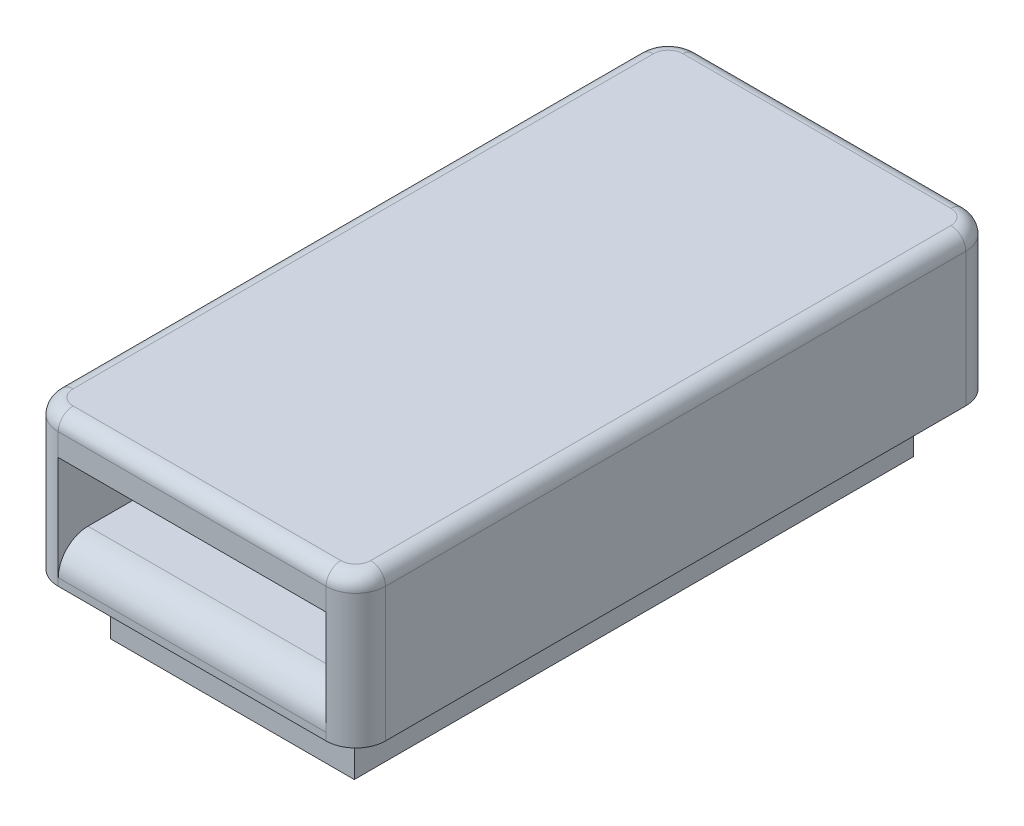
ISO-10303-21;
HEADER;
FILE_DESCRIPTION(('STEP AP214'),'2;1');
FILE_NAME('part.step','',(''),(''),'','','');
FILE_SCHEMA(('AUTOMOTIVE_DESIGN { 1 0 10303 214 1 1 1 1 }'));
ENDSEC;
DATA;
#1=APPLICATION_CONTEXT('core data for automotive mechanical design processes');
#2=APPLICATION_PROTOCOL_DEFINITION('international standard','automotive_design',2000,#1);
#3=PRODUCT_CONTEXT('',#1,'mechanical');
#4=PRODUCT('Part','Part','',(#3));
#5=PRODUCT_RELATED_PRODUCT_CATEGORY('part','',(#4));
#6=PRODUCT_DEFINITION_FORMATION('','',#4);
#7=PRODUCT_DEFINITION_CONTEXT('part definition',#1,'design');
#8=PRODUCT_DEFINITION('design','',#6,#7);
#9=PRODUCT_DEFINITION_SHAPE('','',#8);
#10=(LENGTH_UNIT() NAMED_UNIT(*) SI_UNIT(.MILLI.,.METRE.));
#11=(NAMED_UNIT(*) PLANE_ANGLE_UNIT() SI_UNIT($,.RADIAN.));
#12=(NAMED_UNIT(*) SI_UNIT($,.STERADIAN.) SOLID_ANGLE_UNIT());
#13=UNCERTAINTY_MEASURE_WITH_UNIT(LENGTH_MEASURE(1.E-05),#10,'distance_accuracy_value','');
#14=(GEOMETRIC_REPRESENTATION_CONTEXT(3) GLOBAL_UNCERTAINTY_ASSIGNED_CONTEXT((#13)) GLOBAL_UNIT_ASSIGNED_CONTEXT((#10,
#11,#12)) REPRESENTATION_CONTEXT('',''));
#15=CARTESIAN_POINT('',(0.,0.,0.));
#16=DIRECTION('',(0.,0.,1.));
#17=DIRECTION('',(1.,0.,0.));
#18=AXIS2_PLACEMENT_3D('',#15,#16,#17);
#19=CARTESIAN_POINT('',(-8.99999999999998,10.,21.5));
#20=DIRECTION('',(0.,0.,-1.));
#21=DIRECTION('',(-1.,0.,0.));
#22=AXIS2_PLACEMENT_3D('',#19,#20,#21);
#23=PLANE('',#22);
#24=DIRECTION('',(0.,-1.,0.));
#25=VECTOR('',#24,1.);
#26=CARTESIAN_POINT('',(8.99999999999999,10.,21.5));
#27=LINE('',#26,#25);
#28=CARTESIAN_POINT('',(8.99999999999999,0.499999999999999,21.5));
#29=VERTEX_POINT('',#28);
#30=CARTESIAN_POINT('',(8.99999999999999,0.,21.5));
#31=VERTEX_POINT('',#30);
#32=EDGE_CURVE('E208',#29,#31,#27,.T.);
#33=ORIENTED_EDGE('',*,*,#32,.F.);
#34=DIRECTION('',(1.,0.,0.));
#35=VECTOR('',#34,1.);
#36=CARTESIAN_POINT('',(-8.99999999999999,0.5,21.5));
#37=LINE('',#36,#35);
#38=CARTESIAN_POINT('',(-8.99999999999998,0.499999999999999,21.5));
#39=VERTEX_POINT('',#38);
#40=EDGE_CURVE('E437',#29,#39,#37,.F.);
#41=ORIENTED_EDGE('',*,*,#40,.T.);
#42=DIRECTION('',(0.,-1.,0.));
#43=VECTOR('',#42,1.);
#44=CARTESIAN_POINT('',(-8.99999999999998,10.,21.5));
#45=LINE('',#44,#43);
#46=CARTESIAN_POINT('',(-8.99999999999998,0.,21.5));
#47=VERTEX_POINT('',#46);
#48=EDGE_CURVE('E219',#39,#47,#45,.T.);
#49=ORIENTED_EDGE('',*,*,#48,.T.);
#50=DIRECTION('',(1.,0.,0.));
#51=VECTOR('',#50,1.);
#52=CARTESIAN_POINT('',(-8.99999999999998,0.,21.5));
#53=LINE('',#52,#51);
#54=EDGE_CURVE('E313',#47,#31,#53,.T.);
#55=ORIENTED_EDGE('',*,*,#54,.T.);
#56=EDGE_LOOP('',(#33,#41,#49,#55));
#57=FACE_BOUND('',#56,.T.);
#58=ADVANCED_FACE('F47',(#57),#23,.F.);
#59=CARTESIAN_POINT('',(-8.99999999999998,10.,-21.5));
#60=DIRECTION('',(0.,0.,-1.));
#61=DIRECTION('',(-1.,0.,0.));
#62=AXIS2_PLACEMENT_3D('',#59,#60,#61);
#63=PLANE('',#62);
#64=DIRECTION('',(0.,-1.,0.));
#65=VECTOR('',#64,1.);
#66=CARTESIAN_POINT('',(-8.99999999999998,10.,-21.5));
#67=LINE('',#66,#65);
#68=CARTESIAN_POINT('',(-8.99999999999998,0.499999999999999,-21.5));
#69=VERTEX_POINT('',#68);
#70=CARTESIAN_POINT('',(-8.99999999999998,0.,-21.5));
#71=VERTEX_POINT('',#70);
#72=EDGE_CURVE('E325',#69,#71,#67,.T.);
#73=ORIENTED_EDGE('',*,*,#72,.F.);
#74=DIRECTION('',(1.,0.,0.));
#75=VECTOR('',#74,1.);
#76=CARTESIAN_POINT('',(-8.99999999999998,0.499999999999999,-21.5));
#77=LINE('',#76,#75);
#78=CARTESIAN_POINT('',(8.99999999999999,0.499999999999999,-21.5));
#79=VERTEX_POINT('',#78);
#80=EDGE_CURVE('E441',#69,#79,#77,.T.);
#81=ORIENTED_EDGE('',*,*,#80,.T.);
#82=DIRECTION('',(0.,-1.,0.));
#83=VECTOR('',#82,1.);
#84=CARTESIAN_POINT('',(8.99999999999999,10.,-21.5));
#85=LINE('',#84,#83);
#86=CARTESIAN_POINT('',(8.99999999999999,0.,-21.5));
#87=VERTEX_POINT('',#86);
#88=EDGE_CURVE('E347',#79,#87,#85,.T.);
#89=ORIENTED_EDGE('',*,*,#88,.T.);
#90=DIRECTION('',(1.,0.,0.));
#91=VECTOR('',#90,1.);
#92=CARTESIAN_POINT('',(-8.99999999999998,0.,-21.5));
#93=LINE('',#92,#91);
#94=EDGE_CURVE('E297',#71,#87,#93,.T.);
#95=ORIENTED_EDGE('',*,*,#94,.F.);
#96=EDGE_LOOP('',(#73,#81,#89,#95));
#97=FACE_BOUND('',#96,.T.);
#98=ADVANCED_FACE('F456',(#97),#63,.T.);
#99=CARTESIAN_POINT('',(-9.,10.,-19.5));
#100=DIRECTION('',(0.,-1.,0.));
#101=DIRECTION('',(0.,0.,-1.));
#102=AXIS2_PLACEMENT_3D('',#99,#100,#101);
#103=CYLINDRICAL_SURFACE('',#102,2.);
#104=DIRECTION('',(0.,-1.,0.));
#105=VECTOR('',#104,1.);
#106=CARTESIAN_POINT('',(-11.,10.,-19.5));
#107=LINE('',#106,#105);
#108=CARTESIAN_POINT('',(-11.,9.,-19.5));
#109=VERTEX_POINT('',#108);
#110=CARTESIAN_POINT('',(-11.,0.,-19.5));
#111=VERTEX_POINT('',#110);
#112=EDGE_CURVE('E326',#109,#111,#107,.T.);
#113=ORIENTED_EDGE('',*,*,#112,.F.);
#114=CARTESIAN_POINT('',(-9.,9.,-19.5));
#115=DIRECTION('',(0.,-1.,0.));
#116=DIRECTION('',(0.,0.,-1.));
#117=AXIS2_PLACEMENT_3D('',#114,#115,#116);
#118=CIRCLE('',#117,2.);
#119=CARTESIAN_POINT('',(-8.99999999999998,9.,-21.5));
#120=VERTEX_POINT('',#119);
#121=EDGE_CURVE('E384',#109,#120,#118,.T.);
#122=ORIENTED_EDGE('',*,*,#121,.T.);
#123=CARTESIAN_POINT('',(-8.99999999999999,7.5,-21.5));
#124=VERTEX_POINT('',#123);
#125=EDGE_CURVE('E348',#120,#124,#67,.T.);
#126=ORIENTED_EDGE('',*,*,#125,.T.);
#127=EDGE_CURVE('E352',#124,#69,#67,.T.);
#128=ORIENTED_EDGE('',*,*,#127,.T.);
#129=ORIENTED_EDGE('',*,*,#72,.T.);
#130=CARTESIAN_POINT('',(-9.,0.,-19.5));
#131=DIRECTION('',(0.,-1.,0.));
#132=DIRECTION('',(0.,0.,-1.));
#133=AXIS2_PLACEMENT_3D('',#130,#131,#132);
#134=CIRCLE('',#133,2.);
#135=EDGE_CURVE('E284',#111,#71,#134,.T.);
#136=ORIENTED_EDGE('',*,*,#135,.F.);
#137=EDGE_LOOP('',(#113,#122,#126,#128,#129,#136));
#138=FACE_BOUND('',#137,.T.);
#139=ADVANCED_FACE('F494',(#138),#103,.T.);
#140=CARTESIAN_POINT('',(-11.,10.,19.5));
#141=DIRECTION('',(-1.,0.,0.));
#142=DIRECTION('',(0.,0.,1.));
#143=AXIS2_PLACEMENT_3D('',#140,#141,#142);
#144=PLANE('',#143);
#145=DIRECTION('',(0.,-1.,0.));
#146=VECTOR('',#145,1.);
#147=CARTESIAN_POINT('',(-11.,10.,19.5));
#148=LINE('',#147,#146);
#149=CARTESIAN_POINT('',(-11.,9.,19.5));
#150=VERTEX_POINT('',#149);
#151=CARTESIAN_POINT('',(-11.,0.,19.5));
#152=VERTEX_POINT('',#151);
#153=EDGE_CURVE('E330',#150,#152,#148,.T.);
#154=ORIENTED_EDGE('',*,*,#153,.F.);
#155=DIRECTION('',(0.,0.,-1.));
#156=VECTOR('',#155,1.);
#157=CARTESIAN_POINT('',(-11.,9.,-19.5));
#158=LINE('',#157,#156);
#159=EDGE_CURVE('E381',#150,#109,#158,.T.);
#160=ORIENTED_EDGE('',*,*,#159,.T.);
#161=ORIENTED_EDGE('',*,*,#112,.T.);
#162=DIRECTION('',(0.,0.,-1.));
#163=VECTOR('',#162,1.);
#164=CARTESIAN_POINT('',(-11.,0.,19.5));
#165=LINE('',#164,#163);
#166=EDGE_CURVE('E321',#152,#111,#165,.T.);
#167=ORIENTED_EDGE('',*,*,#166,.F.);
#168=EDGE_LOOP('',(#154,#160,#161,#167));
#169=FACE_BOUND('',#168,.T.);
#170=ADVANCED_FACE('F507',(#169),#144,.T.);
#171=CARTESIAN_POINT('',(-9.,10.,19.5));
#172=DIRECTION('',(0.,-1.,0.));
#173=DIRECTION('',(0.,0.,-1.));
#174=AXIS2_PLACEMENT_3D('',#171,#172,#173);
#175=CYLINDRICAL_SURFACE('',#174,2.);
#176=CARTESIAN_POINT('',(-8.99999999999998,9.,21.5));
#177=VERTEX_POINT('',#176);
#178=CARTESIAN_POINT('',(-8.99999999999999,7.5,21.5));
#179=VERTEX_POINT('',#178);
#180=EDGE_CURVE('E234',#177,#179,#45,.T.);
#181=ORIENTED_EDGE('',*,*,#180,.F.);
#182=CARTESIAN_POINT('',(-9.,9.,19.5));
#183=DIRECTION('',(0.,-1.,0.));
#184=DIRECTION('',(0.,0.,-1.));
#185=AXIS2_PLACEMENT_3D('',#182,#183,#184);
#186=CIRCLE('',#185,2.);
#187=EDGE_CURVE('E329',#177,#150,#186,.T.);
#188=ORIENTED_EDGE('',*,*,#187,.T.);
#189=ORIENTED_EDGE('',*,*,#153,.T.);
#190=CARTESIAN_POINT('',(-9.,0.,19.5));
#191=DIRECTION('',(0.,-1.,0.));
#192=DIRECTION('',(0.,0.,-1.));
#193=AXIS2_PLACEMENT_3D('',#190,#191,#192);
#194=CIRCLE('',#193,2.);
#195=EDGE_CURVE('E317',#47,#152,#194,.T.);
#196=ORIENTED_EDGE('',*,*,#195,.F.);
#197=ORIENTED_EDGE('',*,*,#48,.F.);
#198=EDGE_CURVE('E334',#179,#39,#45,.T.);
#199=ORIENTED_EDGE('',*,*,#198,.F.);
#200=EDGE_LOOP('',(#181,#188,#189,#196,#197,#199));
#201=FACE_BOUND('',#200,.T.);
#202=ADVANCED_FACE('F476',(#201),#175,.T.);
#203=CARTESIAN_POINT('',(8.99999999999999,9.,21.5));
#204=VERTEX_POINT('',#203);
#205=CARTESIAN_POINT('',(8.99999999999999,7.5,21.5));
#206=VERTEX_POINT('',#205);
#207=EDGE_CURVE('E207',#204,#206,#27,.T.);
#208=ORIENTED_EDGE('',*,*,#207,.F.);
#209=DIRECTION('',(1.,0.,0.));
#210=VECTOR('',#209,1.);
#211=CARTESIAN_POINT('',(-8.99999999999998,9.,21.5));
#212=LINE('',#211,#210);
#213=EDGE_CURVE('E398',#204,#177,#212,.F.);
#214=ORIENTED_EDGE('',*,*,#213,.T.);
#215=ORIENTED_EDGE('',*,*,#180,.T.);
#216=DIRECTION('',(1.,0.,0.));
#217=VECTOR('',#216,1.);
#218=CARTESIAN_POINT('',(-8.99999999999999,7.5,21.5));
#219=LINE('',#218,#217);
#220=EDGE_CURVE('E225',#179,#206,#219,.T.);
#221=ORIENTED_EDGE('',*,*,#220,.T.);
#222=EDGE_LOOP('',(#208,#214,#215,#221));
#223=FACE_BOUND('',#222,.T.);
#224=ADVANCED_FACE('F232',(#223),#23,.F.);
#225=CARTESIAN_POINT('',(9.,10.,19.5));
#226=DIRECTION('',(0.,-1.,0.));
#227=DIRECTION('',(0.,0.,-1.));
#228=AXIS2_PLACEMENT_3D('',#225,#226,#227);
#229=CYLINDRICAL_SURFACE('',#228,2.);
#230=DIRECTION('',(0.,-1.,0.));
#231=VECTOR('',#230,1.);
#232=CARTESIAN_POINT('',(11.,10.,19.5));
#233=LINE('',#232,#231);
#234=CARTESIAN_POINT('',(11.,9.,19.5));
#235=VERTEX_POINT('',#234);
#236=CARTESIAN_POINT('',(11.,0.,19.5));
#237=VERTEX_POINT('',#236);
#238=EDGE_CURVE('E336',#235,#237,#233,.T.);
#239=ORIENTED_EDGE('',*,*,#238,.F.);
#240=CARTESIAN_POINT('',(9.,9.,19.5));
#241=DIRECTION('',(0.,-1.,0.));
#242=DIRECTION('',(0.,0.,-1.));
#243=AXIS2_PLACEMENT_3D('',#240,#241,#242);
#244=CIRCLE('',#243,2.);
#245=EDGE_CURVE('E214',#235,#204,#244,.T.);
#246=ORIENTED_EDGE('',*,*,#245,.T.);
#247=ORIENTED_EDGE('',*,*,#207,.T.);
#248=EDGE_CURVE('E196',#206,#29,#27,.T.);
#249=ORIENTED_EDGE('',*,*,#248,.T.);
#250=ORIENTED_EDGE('',*,*,#32,.T.);
#251=CARTESIAN_POINT('',(9.,0.,19.5));
#252=DIRECTION('',(0.,1.,0.));
#253=DIRECTION('',(0.,0.,1.));
#254=AXIS2_PLACEMENT_3D('',#251,#252,#253);
#255=CIRCLE('',#254,2.);
#256=EDGE_CURVE('E309',#31,#237,#255,.T.);
#257=ORIENTED_EDGE('',*,*,#256,.T.);
#258=EDGE_LOOP('',(#239,#246,#247,#249,#250,#257));
#259=FACE_BOUND('',#258,.T.);
#260=ADVANCED_FACE('F212',(#259),#229,.T.);
#261=CARTESIAN_POINT('',(11.,10.,19.5));
#262=DIRECTION('',(-1.,0.,0.));
#263=DIRECTION('',(0.,0.,1.));
#264=AXIS2_PLACEMENT_3D('',#261,#262,#263);
#265=PLANE('',#264);
#266=DIRECTION('',(0.,-1.,0.));
#267=VECTOR('',#266,1.);
#268=CARTESIAN_POINT('',(11.,10.,-19.5));
#269=LINE('',#268,#267);
#270=CARTESIAN_POINT('',(11.,9.,-19.5));
#271=VERTEX_POINT('',#270);
#272=CARTESIAN_POINT('',(11.,0.,-19.5));
#273=VERTEX_POINT('',#272);
#274=EDGE_CURVE('E339',#271,#273,#269,.T.);
#275=ORIENTED_EDGE('',*,*,#274,.F.);
#276=DIRECTION('',(0.,0.,-1.));
#277=VECTOR('',#276,1.);
#278=CARTESIAN_POINT('',(11.,9.,19.5));
#279=LINE('',#278,#277);
#280=EDGE_CURVE('E393',#271,#235,#279,.F.);
#281=ORIENTED_EDGE('',*,*,#280,.T.);
#282=ORIENTED_EDGE('',*,*,#238,.T.);
#283=DIRECTION('',(0.,0.,-1.));
#284=VECTOR('',#283,1.);
#285=CARTESIAN_POINT('',(11.,0.,19.5));
#286=LINE('',#285,#284);
#287=EDGE_CURVE('E305',#237,#273,#286,.T.);
#288=ORIENTED_EDGE('',*,*,#287,.T.);
#289=EDGE_LOOP('',(#275,#281,#282,#288));
#290=FACE_BOUND('',#289,.T.);
#291=ADVANCED_FACE('F505',(#290),#265,.F.);
#292=CARTESIAN_POINT('',(9.,10.,-19.5));
#293=DIRECTION('',(0.,-1.,0.));
#294=DIRECTION('',(0.,0.,-1.));
#295=AXIS2_PLACEMENT_3D('',#292,#293,#294);
#296=CYLINDRICAL_SURFACE('',#295,2.);
#297=CARTESIAN_POINT('',(8.99999999999999,9.,-21.5));
#298=VERTEX_POINT('',#297);
#299=CARTESIAN_POINT('',(8.99999999999999,7.5,-21.5));
#300=VERTEX_POINT('',#299);
#301=EDGE_CURVE('E342',#298,#300,#85,.T.);
#302=ORIENTED_EDGE('',*,*,#301,.F.);
#303=CARTESIAN_POINT('',(9.,9.,-19.5));
#304=DIRECTION('',(0.,-1.,0.));
#305=DIRECTION('',(0.,0.,-1.));
#306=AXIS2_PLACEMENT_3D('',#303,#304,#305);
#307=CIRCLE('',#306,2.);
#308=EDGE_CURVE('E390',#298,#271,#307,.T.);
#309=ORIENTED_EDGE('',*,*,#308,.T.);
#310=ORIENTED_EDGE('',*,*,#274,.T.);
#311=CARTESIAN_POINT('',(9.,0.,-19.5));
#312=DIRECTION('',(0.,-1.,0.));
#313=DIRECTION('',(0.,0.,-1.));
#314=AXIS2_PLACEMENT_3D('',#311,#312,#313);
#315=CIRCLE('',#314,2.);
#316=EDGE_CURVE('E301',#87,#273,#315,.T.);
#317=ORIENTED_EDGE('',*,*,#316,.F.);
#318=ORIENTED_EDGE('',*,*,#88,.F.);
#319=EDGE_CURVE('E346',#300,#79,#85,.T.);
#320=ORIENTED_EDGE('',*,*,#319,.F.);
#321=EDGE_LOOP('',(#302,#309,#310,#317,#318,#320));
#322=FACE_BOUND('',#321,.T.);
#323=ADVANCED_FACE('F462',(#322),#296,.T.);
#324=ORIENTED_EDGE('',*,*,#125,.F.);
#325=DIRECTION('',(1.,0.,0.));
#326=VECTOR('',#325,1.);
#327=CARTESIAN_POINT('',(8.99999999999999,9.,-21.5));
#328=LINE('',#327,#326);
#329=EDGE_CURVE('E387',#120,#298,#328,.T.);
#330=ORIENTED_EDGE('',*,*,#329,.T.);
#331=ORIENTED_EDGE('',*,*,#301,.T.);
#332=DIRECTION('',(1.,0.,0.));
#333=VECTOR('',#332,1.);
#334=CARTESIAN_POINT('',(-8.99999999999999,7.5,-21.5));
#335=LINE('',#334,#333);
#336=EDGE_CURVE('E227',#124,#300,#335,.T.);
#337=ORIENTED_EDGE('',*,*,#336,.F.);
#338=EDGE_LOOP('',(#324,#330,#331,#337));
#339=FACE_BOUND('',#338,.T.);
#340=ADVANCED_FACE('F496',(#339),#63,.T.);
#341=CARTESIAN_POINT('',(-9.,10.,-19.5));
#342=DIRECTION('',(0.,-1.,0.));
#343=DIRECTION('',(0.,0.,-1.));
#344=AXIS2_PLACEMENT_3D('',#341,#342,#343);
#345=PLANE('',#344);
#346=DIRECTION('',(0.,0.,-1.));
#347=VECTOR('',#346,1.);
#348=CARTESIAN_POINT('',(-10.,10.,19.5));
#349=LINE('',#348,#347);
#350=CARTESIAN_POINT('',(-10.,10.,-19.5));
#351=VERTEX_POINT('',#350);
#352=CARTESIAN_POINT('',(-10.,10.,19.5));
#353=VERTEX_POINT('',#352);
#354=EDGE_CURVE('E374',#351,#353,#349,.F.);
#355=ORIENTED_EDGE('',*,*,#354,.T.);
#356=CARTESIAN_POINT('',(-9.,10.,19.5));
#357=DIRECTION('',(0.,-1.,0.));
#358=DIRECTION('',(0.,0.,-1.));
#359=AXIS2_PLACEMENT_3D('',#356,#357,#358);
#360=CIRCLE('',#359,0.999999999999999);
#361=CARTESIAN_POINT('',(-8.99999999999999,10.,20.5));
#362=VERTEX_POINT('',#361);
#363=EDGE_CURVE('E377',#353,#362,#360,.F.);
#364=ORIENTED_EDGE('',*,*,#363,.T.);
#365=DIRECTION('',(1.,0.,0.));
#366=VECTOR('',#365,1.);
#367=CARTESIAN_POINT('',(-9.,10.,20.5));
#368=LINE('',#367,#366);
#369=CARTESIAN_POINT('',(8.99999999999999,10.,20.5));
#370=VERTEX_POINT('',#369);
#371=EDGE_CURVE('E356',#362,#370,#368,.T.);
#372=ORIENTED_EDGE('',*,*,#371,.T.);
#373=CARTESIAN_POINT('',(9.,10.,19.5));
#374=DIRECTION('',(0.,-1.,0.));
#375=DIRECTION('',(0.,0.,-1.));
#376=AXIS2_PLACEMENT_3D('',#373,#374,#375);
#377=CIRCLE('',#376,0.999999999999999);
#378=CARTESIAN_POINT('',(10.,10.,19.5));
#379=VERTEX_POINT('',#378);
#380=EDGE_CURVE('E359',#370,#379,#377,.F.);
#381=ORIENTED_EDGE('',*,*,#380,.T.);
#382=DIRECTION('',(0.,0.,-1.));
#383=VECTOR('',#382,1.);
#384=CARTESIAN_POINT('',(10.,10.,-19.5));
#385=LINE('',#384,#383);
#386=CARTESIAN_POINT('',(10.,10.,-19.5));
#387=VERTEX_POINT('',#386);
#388=EDGE_CURVE('E362',#379,#387,#385,.T.);
#389=ORIENTED_EDGE('',*,*,#388,.T.);
#390=CARTESIAN_POINT('',(9.,10.,-19.5));
#391=DIRECTION('',(0.,-1.,0.));
#392=DIRECTION('',(0.,0.,-1.));
#393=AXIS2_PLACEMENT_3D('',#390,#391,#392);
#394=CIRCLE('',#393,0.999999999999999);
#395=CARTESIAN_POINT('',(8.99999999999999,10.,-20.5));
#396=VERTEX_POINT('',#395);
#397=EDGE_CURVE('E365',#387,#396,#394,.F.);
#398=ORIENTED_EDGE('',*,*,#397,.T.);
#399=DIRECTION('',(1.,0.,0.));
#400=VECTOR('',#399,1.);
#401=CARTESIAN_POINT('',(-8.99999999999998,10.,-20.5));
#402=LINE('',#401,#400);
#403=CARTESIAN_POINT('',(-8.99999999999999,10.,-20.5));
#404=VERTEX_POINT('',#403);
#405=EDGE_CURVE('E368',#396,#404,#402,.F.);
#406=ORIENTED_EDGE('',*,*,#405,.T.);
#407=CARTESIAN_POINT('',(-9.,10.,-19.5));
#408=DIRECTION('',(0.,-1.,0.));
#409=DIRECTION('',(0.,0.,-1.));
#410=AXIS2_PLACEMENT_3D('',#407,#408,#409);
#411=CIRCLE('',#410,0.999999999999999);
#412=EDGE_CURVE('E371',#404,#351,#411,.F.);
#413=ORIENTED_EDGE('',*,*,#412,.T.);
#414=EDGE_LOOP('',(#355,#364,#372,#381,#389,#398,#406,#413));
#415=FACE_BOUND('',#414,.T.);
#416=ADVANCED_FACE('F518',(#415),#345,.F.);
#417=CARTESIAN_POINT('',(-9.,0.,-19.5));
#418=DIRECTION('',(0.,-1.,0.));
#419=DIRECTION('',(0.,0.,-1.));
#420=AXIS2_PLACEMENT_3D('',#417,#418,#419);
#421=PLANE('',#420);
#422=DIRECTION('',(0.,0.,-1.));
#423=VECTOR('',#422,1.);
#424=CARTESIAN_POINT('',(-8.2,0.,0.));
#425=LINE('',#424,#423);
#426=CARTESIAN_POINT('',(-8.2,0.,18.8));
#427=VERTEX_POINT('',#426);
#428=CARTESIAN_POINT('',(-8.2,0.,-18.8));
#429=VERTEX_POINT('',#428);
#430=EDGE_CURVE('E245',#427,#429,#425,.T.);
#431=ORIENTED_EDGE('',*,*,#430,.F.);
#432=DIRECTION('',(-1.,0.,0.));
#433=VECTOR('',#432,1.);
#434=CARTESIAN_POINT('',(0.,0.,18.8));
#435=LINE('',#434,#433);
#436=CARTESIAN_POINT('',(8.2,0.,18.8));
#437=VERTEX_POINT('',#436);
#438=EDGE_CURVE('E270',#437,#427,#435,.T.);
#439=ORIENTED_EDGE('',*,*,#438,.F.);
#440=DIRECTION('',(0.,0.,-1.));
#441=VECTOR('',#440,1.);
#442=CARTESIAN_POINT('',(8.2,0.,0.));
#443=LINE('',#442,#441);
#444=CARTESIAN_POINT('',(8.2,0.,-18.8));
#445=VERTEX_POINT('',#444);
#446=EDGE_CURVE('E273',#437,#445,#443,.T.);
#447=ORIENTED_EDGE('',*,*,#446,.T.);
#448=DIRECTION('',(-1.,0.,0.));
#449=VECTOR('',#448,1.);
#450=CARTESIAN_POINT('',(0.,0.,-18.8));
#451=LINE('',#450,#449);
#452=EDGE_CURVE('E256',#445,#429,#451,.T.);
#453=ORIENTED_EDGE('',*,*,#452,.T.);
#454=EDGE_LOOP('',(#431,#439,#447,#453));
#455=FACE_BOUND('',#454,.T.);
#456=ORIENTED_EDGE('',*,*,#135,.T.);
#457=ORIENTED_EDGE('',*,*,#94,.T.);
#458=ORIENTED_EDGE('',*,*,#316,.T.);
#459=ORIENTED_EDGE('',*,*,#287,.F.);
#460=ORIENTED_EDGE('',*,*,#256,.F.);
#461=ORIENTED_EDGE('',*,*,#54,.F.);
#462=ORIENTED_EDGE('',*,*,#195,.T.);
#463=ORIENTED_EDGE('',*,*,#166,.T.);
#464=EDGE_LOOP('',(#456,#457,#458,#459,#460,#461,#462,#463));
#465=FACE_BOUND('',#464,.T.);
#466=ADVANCED_FACE('F514',(#455,#465),#421,.T.);
#467=CARTESIAN_POINT('',(-8.2,-4.,0.));
#468=DIRECTION('',(1.,0.,0.));
#469=DIRECTION('',(0.,0.,-1.));
#470=AXIS2_PLACEMENT_3D('',#467,#468,#469);
#471=PLANE('',#470);
#472=ORIENTED_EDGE('',*,*,#430,.T.);
#473=DIRECTION('',(0.,1.,0.));
#474=VECTOR('',#473,1.);
#475=CARTESIAN_POINT('',(-8.2,-4.,-18.8));
#476=LINE('',#475,#474);
#477=CARTESIAN_POINT('',(-8.2,-4.,-18.8));
#478=VERTEX_POINT('',#477);
#479=EDGE_CURVE('E280',#478,#429,#476,.T.);
#480=ORIENTED_EDGE('',*,*,#479,.F.);
#481=DIRECTION('',(0.,0.,-1.));
#482=VECTOR('',#481,1.);
#483=CARTESIAN_POINT('',(-8.2,-4.,0.));
#484=LINE('',#483,#482);
#485=CARTESIAN_POINT('',(-8.2,-4.,18.8));
#486=VERTEX_POINT('',#485);
#487=EDGE_CURVE('E252',#486,#478,#484,.T.);
#488=ORIENTED_EDGE('',*,*,#487,.F.);
#489=DIRECTION('',(0.,1.,0.));
#490=VECTOR('',#489,1.);
#491=CARTESIAN_POINT('',(-8.2,-4.,18.8));
#492=LINE('',#491,#490);
#493=EDGE_CURVE('E267',#486,#427,#492,.T.);
#494=ORIENTED_EDGE('',*,*,#493,.T.);
#495=EDGE_LOOP('',(#472,#480,#488,#494));
#496=FACE_BOUND('',#495,.T.);
#497=ADVANCED_FACE('F517',(#496),#471,.F.);
#498=CARTESIAN_POINT('',(0.,-4.,-18.8));
#499=DIRECTION('',(0.,0.,-1.));
#500=DIRECTION('',(-1.,0.,0.));
#501=AXIS2_PLACEMENT_3D('',#498,#499,#500);
#502=PLANE('',#501);
#503=ORIENTED_EDGE('',*,*,#452,.F.);
#504=DIRECTION('',(0.,1.,0.));
#505=VECTOR('',#504,1.);
#506=CARTESIAN_POINT('',(8.2,-4.,-18.8));
#507=LINE('',#506,#505);
#508=CARTESIAN_POINT('',(8.2,-4.,-18.8));
#509=VERTEX_POINT('',#508);
#510=EDGE_CURVE('E285',#509,#445,#507,.T.);
#511=ORIENTED_EDGE('',*,*,#510,.F.);
#512=DIRECTION('',(-1.,0.,0.));
#513=VECTOR('',#512,1.);
#514=CARTESIAN_POINT('',(0.,-4.,-18.8));
#515=LINE('',#514,#513);
#516=EDGE_CURVE('E263',#509,#478,#515,.T.);
#517=ORIENTED_EDGE('',*,*,#516,.T.);
#518=ORIENTED_EDGE('',*,*,#479,.T.);
#519=EDGE_LOOP('',(#503,#511,#517,#518));
#520=FACE_BOUND('',#519,.T.);
#521=ADVANCED_FACE('F525',(#520),#502,.T.);
#522=CARTESIAN_POINT('',(8.2,-4.,0.));
#523=DIRECTION('',(1.,0.,0.));
#524=DIRECTION('',(0.,0.,-1.));
#525=AXIS2_PLACEMENT_3D('',#522,#523,#524);
#526=PLANE('',#525);
#527=ORIENTED_EDGE('',*,*,#446,.F.);
#528=DIRECTION('',(0.,1.,0.));
#529=VECTOR('',#528,1.);
#530=CARTESIAN_POINT('',(8.2,-4.,18.8));
#531=LINE('',#530,#529);
#532=CARTESIAN_POINT('',(8.2,-4.,18.8));
#533=VERTEX_POINT('',#532);
#534=EDGE_CURVE('E288',#533,#437,#531,.T.);
#535=ORIENTED_EDGE('',*,*,#534,.F.);
#536=DIRECTION('',(0.,0.,-1.));
#537=VECTOR('',#536,1.);
#538=CARTESIAN_POINT('',(8.2,-4.,0.));
#539=LINE('',#538,#537);
#540=EDGE_CURVE('E259',#533,#509,#539,.T.);
#541=ORIENTED_EDGE('',*,*,#540,.T.);
#542=ORIENTED_EDGE('',*,*,#510,.T.);
#543=EDGE_LOOP('',(#527,#535,#541,#542));
#544=FACE_BOUND('',#543,.T.);
#545=ADVANCED_FACE('F531',(#544),#526,.T.);
#546=CARTESIAN_POINT('',(0.,-4.,18.8));
#547=DIRECTION('',(0.,0.,-1.));
#548=DIRECTION('',(-1.,0.,0.));
#549=AXIS2_PLACEMENT_3D('',#546,#547,#548);
#550=PLANE('',#549);
#551=ORIENTED_EDGE('',*,*,#438,.T.);
#552=ORIENTED_EDGE('',*,*,#493,.F.);
#553=DIRECTION('',(-1.,0.,0.));
#554=VECTOR('',#553,1.);
#555=CARTESIAN_POINT('',(0.,-4.,18.8));
#556=LINE('',#555,#554);
#557=EDGE_CURVE('E255',#533,#486,#556,.T.);
#558=ORIENTED_EDGE('',*,*,#557,.F.);
#559=ORIENTED_EDGE('',*,*,#534,.T.);
#560=EDGE_LOOP('',(#551,#552,#558,#559));
#561=FACE_BOUND('',#560,.T.);
#562=ADVANCED_FACE('F527',(#561),#550,.F.);
#563=CARTESIAN_POINT('',(0.,-4.,0.));
#564=DIRECTION('',(0.,1.,0.));
#565=DIRECTION('',(0.,0.,1.));
#566=AXIS2_PLACEMENT_3D('',#563,#564,#565);
#567=PLANE('',#566);
#568=ORIENTED_EDGE('',*,*,#487,.T.);
#569=ORIENTED_EDGE('',*,*,#516,.F.);
#570=ORIENTED_EDGE('',*,*,#540,.F.);
#571=ORIENTED_EDGE('',*,*,#557,.T.);
#572=EDGE_LOOP('',(#568,#569,#570,#571));
#573=FACE_BOUND('',#572,.T.);
#574=ADVANCED_FACE('F530',(#573),#567,.F.);
#575=CARTESIAN_POINT('',(-8.99999999999999,7.5,21.5));
#576=DIRECTION('',(0.,1.,0.));
#577=DIRECTION('',(0.,0.,1.));
#578=AXIS2_PLACEMENT_3D('',#575,#576,#577);
#579=PLANE('',#578);
#580=ORIENTED_EDGE('',*,*,#336,.T.);
#581=DIRECTION('',(0.,0.,-1.));
#582=VECTOR('',#581,1.);
#583=CARTESIAN_POINT('',(8.99999999999999,7.5,21.5));
#584=LINE('',#583,#582);
#585=EDGE_CURVE('E200',#206,#300,#584,.T.);
#586=ORIENTED_EDGE('',*,*,#585,.F.);
#587=ORIENTED_EDGE('',*,*,#220,.F.);
#588=DIRECTION('',(0.,0.,-1.));
#589=VECTOR('',#588,1.);
#590=CARTESIAN_POINT('',(-8.99999999999999,7.5,21.5));
#591=LINE('',#590,#589);
#592=EDGE_CURVE('E242',#179,#124,#591,.T.);
#593=ORIENTED_EDGE('',*,*,#592,.T.);
#594=EDGE_LOOP('',(#580,#586,#587,#593));
#595=FACE_BOUND('',#594,.T.);
#596=ADVANCED_FACE('F223',(#595),#579,.F.);
#597=CARTESIAN_POINT('',(-8.99999999999999,7.5,21.5));
#598=DIRECTION('',(1.,0.,0.));
#599=DIRECTION('',(0.,0.,-1.));
#600=AXIS2_PLACEMENT_3D('',#597,#598,#599);
#601=PLANE('',#600);
#602=ORIENTED_EDGE('',*,*,#127,.F.);
#603=ORIENTED_EDGE('',*,*,#592,.F.);
#604=ORIENTED_EDGE('',*,*,#198,.T.);
#605=CARTESIAN_POINT('',(-8.99999999999999,0.5,19.5));
#606=DIRECTION('',(1.,0.,0.));
#607=DIRECTION('',(0.,0.,-1.));
#608=AXIS2_PLACEMENT_3D('',#605,#606,#607);
#609=CIRCLE('',#608,2.);
#610=CARTESIAN_POINT('',(-8.99999999999999,2.5,19.5));
#611=VERTEX_POINT('',#610);
#612=EDGE_CURVE('E447',#39,#611,#609,.F.);
#613=ORIENTED_EDGE('',*,*,#612,.T.);
#614=DIRECTION('',(0.,0.,-1.));
#615=VECTOR('',#614,1.);
#616=CARTESIAN_POINT('',(-8.99999999999999,2.5,21.5));
#617=LINE('',#616,#615);
#618=CARTESIAN_POINT('',(-8.99999999999999,2.5,-19.5));
#619=VERTEX_POINT('',#618);
#620=EDGE_CURVE('E246',#611,#619,#617,.T.);
#621=ORIENTED_EDGE('',*,*,#620,.T.);
#622=CARTESIAN_POINT('',(-8.99999999999999,0.499999999999999,-19.5));
#623=DIRECTION('',(1.,0.,0.));
#624=DIRECTION('',(0.,0.,-1.));
#625=AXIS2_PLACEMENT_3D('',#622,#623,#624);
#626=CIRCLE('',#625,2.);
#627=EDGE_CURVE('E11',#619,#69,#626,.F.);
#628=ORIENTED_EDGE('',*,*,#627,.T.);
#629=EDGE_LOOP('',(#602,#603,#604,#613,#621,#628));
#630=FACE_BOUND('',#629,.T.);
#631=ADVANCED_FACE('F468',(#630),#601,.T.);
#632=CARTESIAN_POINT('',(-8.99999999999999,2.5,21.5));
#633=DIRECTION('',(0.,1.,0.));
#634=DIRECTION('',(0.,0.,1.));
#635=AXIS2_PLACEMENT_3D('',#632,#633,#634);
#636=PLANE('',#635);
#637=ORIENTED_EDGE('',*,*,#620,.F.);
#638=DIRECTION('',(1.,0.,0.));
#639=VECTOR('',#638,1.);
#640=CARTESIAN_POINT('',(8.99999999999999,2.5,19.5));
#641=LINE('',#640,#639);
#642=CARTESIAN_POINT('',(8.99999999999999,2.5,19.5));
#643=VERTEX_POINT('',#642);
#644=EDGE_CURVE('E433',#611,#643,#641,.T.);
#645=ORIENTED_EDGE('',*,*,#644,.T.);
#646=DIRECTION('',(0.,0.,-1.));
#647=VECTOR('',#646,1.);
#648=CARTESIAN_POINT('',(8.99999999999999,2.5,21.5));
#649=LINE('',#648,#647);
#650=CARTESIAN_POINT('',(8.99999999999999,2.5,-19.5));
#651=VERTEX_POINT('',#650);
#652=EDGE_CURVE('E229',#643,#651,#649,.T.);
#653=ORIENTED_EDGE('',*,*,#652,.T.);
#654=DIRECTION('',(1.,0.,0.));
#655=VECTOR('',#654,1.);
#656=CARTESIAN_POINT('',(-8.99999999999999,2.5,-19.5));
#657=LINE('',#656,#655);
#658=EDGE_CURVE('E401',#651,#619,#657,.F.);
#659=ORIENTED_EDGE('',*,*,#658,.T.);
#660=EDGE_LOOP('',(#637,#645,#653,#659));
#661=FACE_BOUND('',#660,.T.);
#662=ADVANCED_FACE('F452',(#661),#636,.T.);
#663=CARTESIAN_POINT('',(8.99999999999999,7.5,21.5));
#664=DIRECTION('',(1.,0.,0.));
#665=DIRECTION('',(0.,0.,-1.));
#666=AXIS2_PLACEMENT_3D('',#663,#664,#665);
#667=PLANE('',#666);
#668=ORIENTED_EDGE('',*,*,#585,.T.);
#669=ORIENTED_EDGE('',*,*,#319,.T.);
#670=CARTESIAN_POINT('',(8.99999999999999,0.499999999999999,-19.5));
#671=DIRECTION('',(1.,0.,0.));
#672=DIRECTION('',(0.,0.,-1.));
#673=AXIS2_PLACEMENT_3D('',#670,#671,#672);
#674=CIRCLE('',#673,2.);
#675=EDGE_CURVE('E56',#79,#651,#674,.T.);
#676=ORIENTED_EDGE('',*,*,#675,.T.);
#677=ORIENTED_EDGE('',*,*,#652,.F.);
#678=CARTESIAN_POINT('',(8.99999999999999,0.5,19.5));
#679=DIRECTION('',(1.,0.,0.));
#680=DIRECTION('',(0.,0.,-1.));
#681=AXIS2_PLACEMENT_3D('',#678,#679,#680);
#682=CIRCLE('',#681,2.);
#683=EDGE_CURVE('E202',#643,#29,#682,.T.);
#684=ORIENTED_EDGE('',*,*,#683,.T.);
#685=ORIENTED_EDGE('',*,*,#248,.F.);
#686=EDGE_LOOP('',(#668,#669,#676,#677,#684,#685));
#687=FACE_BOUND('',#686,.T.);
#688=ADVANCED_FACE('F198',(#687),#667,.F.);
#689=CARTESIAN_POINT('',(9.,9.,-19.5));
#690=DIRECTION('',(0.,-1.,0.));
#691=DIRECTION('',(0.,0.,-1.));
#692=AXIS2_PLACEMENT_3D('',#689,#690,#691);
#693=DEGENERATE_TOROIDAL_SURFACE('',#692,0.999999999999999,1.,.T.);
#694=CARTESIAN_POINT('',(8.99999999999999,9.,-20.5));
#695=DIRECTION('',(-1.,0.,0.));
#696=DIRECTION('',(0.,0.,1.));
#697=AXIS2_PLACEMENT_3D('',#694,#695,#696);
#698=CIRCLE('',#697,1.);
#699=EDGE_CURVE('E424',#396,#298,#698,.T.);
#700=ORIENTED_EDGE('',*,*,#699,.F.);
#701=ORIENTED_EDGE('',*,*,#397,.F.);
#702=CARTESIAN_POINT('',(10.,9.,-19.5));
#703=DIRECTION('',(0.,0.,1.));
#704=DIRECTION('',(1.,0.,0.));
#705=AXIS2_PLACEMENT_3D('',#702,#703,#704);
#706=CIRCLE('',#705,1.);
#707=EDGE_CURVE('E239',#271,#387,#706,.T.);
#708=ORIENTED_EDGE('',*,*,#707,.F.);
#709=ORIENTED_EDGE('',*,*,#308,.F.);
#710=EDGE_LOOP('',(#700,#701,#708,#709));
#711=FACE_BOUND('',#710,.T.);
#712=ADVANCED_FACE('F545',(#711),#693,.T.);
#713=CARTESIAN_POINT('',(10.,9.,-19.5));
#714=DIRECTION('',(0.,0.,-1.));
#715=DIRECTION('',(-1.,0.,0.));
#716=AXIS2_PLACEMENT_3D('',#713,#714,#715);
#717=CYLINDRICAL_SURFACE('',#716,1.);
#718=ORIENTED_EDGE('',*,*,#707,.T.);
#719=ORIENTED_EDGE('',*,*,#388,.F.);
#720=CARTESIAN_POINT('',(10.,9.,19.5));
#721=DIRECTION('',(0.,0.,1.));
#722=DIRECTION('',(1.,0.,0.));
#723=AXIS2_PLACEMENT_3D('',#720,#721,#722);
#724=CIRCLE('',#723,1.);
#725=EDGE_CURVE('E420',#235,#379,#724,.T.);
#726=ORIENTED_EDGE('',*,*,#725,.F.);
#727=ORIENTED_EDGE('',*,*,#280,.F.);
#728=EDGE_LOOP('',(#718,#719,#726,#727));
#729=FACE_BOUND('',#728,.T.);
#730=ADVANCED_FACE('F575',(#729),#717,.T.);
#731=CARTESIAN_POINT('',(-8.99999999999998,9.,-20.5));
#732=DIRECTION('',(-1.,0.,0.));
#733=DIRECTION('',(0.,0.,1.));
#734=AXIS2_PLACEMENT_3D('',#731,#732,#733);
#735=CYLINDRICAL_SURFACE('',#734,1.);
#736=ORIENTED_EDGE('',*,*,#699,.T.);
#737=ORIENTED_EDGE('',*,*,#329,.F.);
#738=CARTESIAN_POINT('',(-8.99999999999999,9.,-20.5));
#739=DIRECTION('',(-1.,0.,0.));
#740=DIRECTION('',(0.,0.,1.));
#741=AXIS2_PLACEMENT_3D('',#738,#739,#740);
#742=CIRCLE('',#741,1.);
#743=EDGE_CURVE('E416',#404,#120,#742,.T.);
#744=ORIENTED_EDGE('',*,*,#743,.F.);
#745=ORIENTED_EDGE('',*,*,#405,.F.);
#746=EDGE_LOOP('',(#736,#737,#744,#745));
#747=FACE_BOUND('',#746,.T.);
#748=ADVANCED_FACE('F584',(#747),#735,.T.);
#749=CARTESIAN_POINT('',(9.,9.,19.5));
#750=DIRECTION('',(0.,-1.,0.));
#751=DIRECTION('',(0.,0.,-1.));
#752=AXIS2_PLACEMENT_3D('',#749,#750,#751);
#753=DEGENERATE_TOROIDAL_SURFACE('',#752,0.999999999999999,1.,.T.);
#754=ORIENTED_EDGE('',*,*,#725,.T.);
#755=ORIENTED_EDGE('',*,*,#380,.F.);
#756=CARTESIAN_POINT('',(8.99999999999999,9.,20.5));
#757=DIRECTION('',(-1.,0.,0.));
#758=DIRECTION('',(0.,0.,1.));
#759=AXIS2_PLACEMENT_3D('',#756,#757,#758);
#760=CIRCLE('',#759,1.);
#761=EDGE_CURVE('E412',#204,#370,#760,.T.);
#762=ORIENTED_EDGE('',*,*,#761,.F.);
#763=ORIENTED_EDGE('',*,*,#245,.F.);
#764=EDGE_LOOP('',(#754,#755,#762,#763));
#765=FACE_BOUND('',#764,.T.);
#766=ADVANCED_FACE('F594',(#765),#753,.T.);
#767=CARTESIAN_POINT('',(-9.,9.,-19.5));
#768=DIRECTION('',(0.,-1.,0.));
#769=DIRECTION('',(0.,0.,-1.));
#770=AXIS2_PLACEMENT_3D('',#767,#768,#769);
#771=DEGENERATE_TOROIDAL_SURFACE('',#770,0.999999999999999,1.,.T.);
#772=ORIENTED_EDGE('',*,*,#743,.T.);
#773=ORIENTED_EDGE('',*,*,#121,.F.);
#774=CARTESIAN_POINT('',(-10.,9.,-19.5));
#775=DIRECTION('',(0.,0.,1.));
#776=DIRECTION('',(1.,0.,0.));
#777=AXIS2_PLACEMENT_3D('',#774,#775,#776);
#778=CIRCLE('',#777,1.);
#779=EDGE_CURVE('E408',#351,#109,#778,.T.);
#780=ORIENTED_EDGE('',*,*,#779,.F.);
#781=ORIENTED_EDGE('',*,*,#412,.F.);
#782=EDGE_LOOP('',(#772,#773,#780,#781));
#783=FACE_BOUND('',#782,.T.);
#784=ADVANCED_FACE('F604',(#783),#771,.T.);
#785=CARTESIAN_POINT('',(-9.,9.,20.5));
#786=DIRECTION('',(1.,0.,0.));
#787=DIRECTION('',(0.,0.,-1.));
#788=AXIS2_PLACEMENT_3D('',#785,#786,#787);
#789=CYLINDRICAL_SURFACE('',#788,1.);
#790=ORIENTED_EDGE('',*,*,#761,.T.);
#791=ORIENTED_EDGE('',*,*,#371,.F.);
#792=CARTESIAN_POINT('',(-8.99999999999998,9.,20.5));
#793=DIRECTION('',(-1.,0.,0.));
#794=DIRECTION('',(0.,-1.,0.));
#795=AXIS2_PLACEMENT_3D('',#792,#793,#794);
#796=CIRCLE('',#795,1.);
#797=EDGE_CURVE('E405',#177,#362,#796,.T.);
#798=ORIENTED_EDGE('',*,*,#797,.F.);
#799=ORIENTED_EDGE('',*,*,#213,.F.);
#800=EDGE_LOOP('',(#790,#791,#798,#799));
#801=FACE_BOUND('',#800,.T.);
#802=ADVANCED_FACE('F614',(#801),#789,.T.);
#803=CARTESIAN_POINT('',(-10.,9.,19.5));
#804=DIRECTION('',(0.,0.,1.));
#805=DIRECTION('',(1.,0.,0.));
#806=AXIS2_PLACEMENT_3D('',#803,#804,#805);
#807=CYLINDRICAL_SURFACE('',#806,1.);
#808=ORIENTED_EDGE('',*,*,#779,.T.);
#809=ORIENTED_EDGE('',*,*,#159,.F.);
#810=CARTESIAN_POINT('',(-10.,9.,19.5));
#811=DIRECTION('',(0.,0.,1.));
#812=DIRECTION('',(1.,0.,0.));
#813=AXIS2_PLACEMENT_3D('',#810,#811,#812);
#814=CIRCLE('',#813,1.);
#815=EDGE_CURVE('E402',#353,#150,#814,.T.);
#816=ORIENTED_EDGE('',*,*,#815,.F.);
#817=ORIENTED_EDGE('',*,*,#354,.F.);
#818=EDGE_LOOP('',(#808,#809,#816,#817));
#819=FACE_BOUND('',#818,.T.);
#820=ADVANCED_FACE('F485',(#819),#807,.T.);
#821=CARTESIAN_POINT('',(-9.,9.,19.5));
#822=DIRECTION('',(0.,-1.,0.));
#823=DIRECTION('',(0.,0.,-1.));
#824=AXIS2_PLACEMENT_3D('',#821,#822,#823);
#825=DEGENERATE_TOROIDAL_SURFACE('',#824,0.999999999999999,1.,.T.);
#826=ORIENTED_EDGE('',*,*,#797,.T.);
#827=ORIENTED_EDGE('',*,*,#363,.F.);
#828=ORIENTED_EDGE('',*,*,#815,.T.);
#829=ORIENTED_EDGE('',*,*,#187,.F.);
#830=EDGE_LOOP('',(#826,#827,#828,#829));
#831=FACE_BOUND('',#830,.T.);
#832=ADVANCED_FACE('F479',(#831),#825,.T.);
#833=CARTESIAN_POINT('',(-8.99999999999999,0.5,19.5));
#834=DIRECTION('',(-1.,0.,0.));
#835=DIRECTION('',(0.,0.,1.));
#836=AXIS2_PLACEMENT_3D('',#833,#834,#835);
#837=CYLINDRICAL_SURFACE('',#836,2.);
#838=ORIENTED_EDGE('',*,*,#612,.F.);
#839=ORIENTED_EDGE('',*,*,#40,.F.);
#840=ORIENTED_EDGE('',*,*,#683,.F.);
#841=ORIENTED_EDGE('',*,*,#644,.F.);
#842=EDGE_LOOP('',(#838,#839,#840,#841));
#843=FACE_BOUND('',#842,.T.);
#844=ADVANCED_FACE('F477',(#843),#837,.T.);
#845=CARTESIAN_POINT('',(-8.99999999999998,0.499999999999999,-19.5));
#846=DIRECTION('',(1.,0.,0.));
#847=DIRECTION('',(0.,0.,-1.));
#848=AXIS2_PLACEMENT_3D('',#845,#846,#847);
#849=CYLINDRICAL_SURFACE('',#848,2.);
#850=ORIENTED_EDGE('',*,*,#627,.F.);
#851=ORIENTED_EDGE('',*,*,#658,.F.);
#852=ORIENTED_EDGE('',*,*,#675,.F.);
#853=ORIENTED_EDGE('',*,*,#80,.F.);
#854=EDGE_LOOP('',(#850,#851,#852,#853));
#855=FACE_BOUND('',#854,.T.);
#856=ADVANCED_FACE('F49',(#855),#849,.T.);
#857=CLOSED_SHELL('',(#58,#98,#139,#170,#202,#224,#260,#291,#323,#340,#416,#466,#497,#521,#545,
#562,#574,#596,#631,#662,#688,#712,#730,#748,#766,#784,#802,#820,#832,#844,#856));
#858=MANIFOLD_SOLID_BREP('B2',#857);
#859=ADVANCED_BREP_SHAPE_REPRESENTATION('',(#18,#858),#14);
#860=SHAPE_DEFINITION_REPRESENTATION(#9,#859);
ENDSEC;
END-ISO-10303-21;
